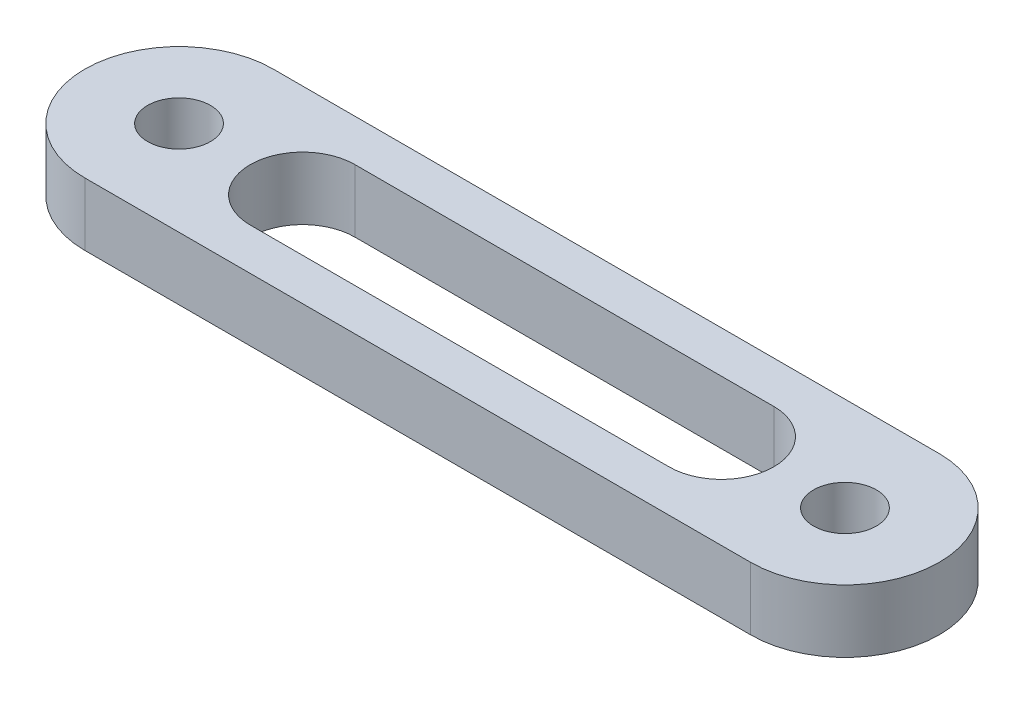
ISO-10303-21;
HEADER;
FILE_DESCRIPTION(('STEP AP214'),'2;1');
FILE_NAME('part.step','',(''),(''),'','','');
FILE_SCHEMA(('AUTOMOTIVE_DESIGN { 1 0 10303 214 1 1 1 1 }'));
ENDSEC;
DATA;
#1=APPLICATION_CONTEXT('core data for automotive mechanical design processes');
#2=APPLICATION_PROTOCOL_DEFINITION('international standard','automotive_design',2000,#1);
#3=PRODUCT_CONTEXT('',#1,'mechanical');
#4=PRODUCT('Part','Part','',(#3));
#5=PRODUCT_RELATED_PRODUCT_CATEGORY('part','',(#4));
#6=PRODUCT_DEFINITION_FORMATION('','',#4);
#7=PRODUCT_DEFINITION_CONTEXT('part definition',#1,'design');
#8=PRODUCT_DEFINITION('design','',#6,#7);
#9=PRODUCT_DEFINITION_SHAPE('','',#8);
#10=(LENGTH_UNIT() NAMED_UNIT(*) SI_UNIT(.MILLI.,.METRE.));
#11=(NAMED_UNIT(*) PLANE_ANGLE_UNIT() SI_UNIT($,.RADIAN.));
#12=(NAMED_UNIT(*) SI_UNIT($,.STERADIAN.) SOLID_ANGLE_UNIT());
#13=UNCERTAINTY_MEASURE_WITH_UNIT(LENGTH_MEASURE(1.E-05),#10,'distance_accuracy_value','');
#14=(GEOMETRIC_REPRESENTATION_CONTEXT(3) GLOBAL_UNCERTAINTY_ASSIGNED_CONTEXT((#13)) GLOBAL_UNIT_ASSIGNED_CONTEXT((#10,
#11,#12)) REPRESENTATION_CONTEXT('',''));
#15=CARTESIAN_POINT('',(0.,0.,0.));
#16=DIRECTION('',(0.,0.,1.));
#17=DIRECTION('',(1.,0.,0.));
#18=AXIS2_PLACEMENT_3D('',#15,#16,#17);
#19=CARTESIAN_POINT('',(-15.9,3.,0.));
#20=DIRECTION('',(0.,-1.,0.));
#21=DIRECTION('',(0.,0.,-1.));
#22=AXIS2_PLACEMENT_3D('',#19,#20,#21);
#23=CYLINDRICAL_SURFACE('',#22,4.5);
#24=CARTESIAN_POINT('',(-15.9,0.,0.));
#25=DIRECTION('',(0.,1.,0.));
#26=DIRECTION('',(0.,0.,1.));
#27=AXIS2_PLACEMENT_3D('',#24,#25,#26);
#28=CIRCLE('',#27,4.5);
#29=CARTESIAN_POINT('',(-15.9,0.,-4.5));
#30=VERTEX_POINT('',#29);
#31=CARTESIAN_POINT('',(-15.9,0.,4.50000000000001));
#32=VERTEX_POINT('',#31);
#33=EDGE_CURVE('E162',#30,#32,#28,.T.);
#34=ORIENTED_EDGE('',*,*,#33,.T.);
#35=DIRECTION('',(0.,-1.,0.));
#36=VECTOR('',#35,1.);
#37=CARTESIAN_POINT('',(-15.9,3.,4.50000000000001));
#38=LINE('',#37,#36);
#39=CARTESIAN_POINT('',(-15.9,3.,4.50000000000001));
#40=VERTEX_POINT('',#39);
#41=EDGE_CURVE('E11',#40,#32,#38,.T.);
#42=ORIENTED_EDGE('',*,*,#41,.F.);
#43=CARTESIAN_POINT('',(-15.9,3.,0.));
#44=DIRECTION('',(0.,1.,0.));
#45=DIRECTION('',(0.,0.,1.));
#46=AXIS2_PLACEMENT_3D('',#43,#44,#45);
#47=CIRCLE('',#46,4.5);
#48=CARTESIAN_POINT('',(-15.9,3.,-4.5));
#49=VERTEX_POINT('',#48);
#50=EDGE_CURVE('E145',#49,#40,#47,.T.);
#51=ORIENTED_EDGE('',*,*,#50,.F.);
#52=DIRECTION('',(0.,-1.,0.));
#53=VECTOR('',#52,1.);
#54=CARTESIAN_POINT('',(-15.9,3.,-4.5));
#55=LINE('',#54,#53);
#56=EDGE_CURVE('E159',#49,#30,#55,.T.);
#57=ORIENTED_EDGE('',*,*,#56,.T.);
#58=EDGE_LOOP('',(#34,#42,#51,#57));
#59=FACE_BOUND('',#58,.T.);
#60=ADVANCED_FACE('F41',(#59),#23,.T.);
#61=CARTESIAN_POINT('',(0.,3.,4.50000000000001));
#62=DIRECTION('',(0.,0.,1.));
#63=DIRECTION('',(1.,0.,0.));
#64=AXIS2_PLACEMENT_3D('',#61,#62,#63);
#65=PLANE('',#64);
#66=DIRECTION('',(-1.,0.,0.));
#67=VECTOR('',#66,1.);
#68=CARTESIAN_POINT('',(0.,0.,4.50000000000001));
#69=LINE('',#68,#67);
#70=CARTESIAN_POINT('',(15.9,0.,4.5));
#71=VERTEX_POINT('',#70);
#72=EDGE_CURVE('E165',#71,#32,#69,.T.);
#73=ORIENTED_EDGE('',*,*,#72,.F.);
#74=DIRECTION('',(0.,-1.,0.));
#75=VECTOR('',#74,1.);
#76=CARTESIAN_POINT('',(15.9,3.,4.5));
#77=LINE('',#76,#75);
#78=CARTESIAN_POINT('',(15.9,3.,4.5));
#79=VERTEX_POINT('',#78);
#80=EDGE_CURVE('E49',#79,#71,#77,.T.);
#81=ORIENTED_EDGE('',*,*,#80,.F.);
#82=DIRECTION('',(-1.,0.,0.));
#83=VECTOR('',#82,1.);
#84=CARTESIAN_POINT('',(0.,3.,4.50000000000001));
#85=LINE('',#84,#83);
#86=EDGE_CURVE('E148',#79,#40,#85,.T.);
#87=ORIENTED_EDGE('',*,*,#86,.T.);
#88=ORIENTED_EDGE('',*,*,#41,.T.);
#89=EDGE_LOOP('',(#73,#81,#87,#88));
#90=FACE_BOUND('',#89,.T.);
#91=ADVANCED_FACE('F190',(#90),#65,.T.);
#92=CARTESIAN_POINT('',(15.9,3.,0.));
#93=DIRECTION('',(0.,-1.,0.));
#94=DIRECTION('',(0.,0.,-1.));
#95=AXIS2_PLACEMENT_3D('',#92,#93,#94);
#96=CYLINDRICAL_SURFACE('',#95,4.5);
#97=CARTESIAN_POINT('',(15.9,0.,0.));
#98=DIRECTION('',(0.,1.,0.));
#99=DIRECTION('',(0.,0.,1.));
#100=AXIS2_PLACEMENT_3D('',#97,#98,#99);
#101=CIRCLE('',#100,4.5);
#102=CARTESIAN_POINT('',(15.9,0.,-4.50000000000001));
#103=VERTEX_POINT('',#102);
#104=EDGE_CURVE('E168',#71,#103,#101,.T.);
#105=ORIENTED_EDGE('',*,*,#104,.T.);
#106=DIRECTION('',(0.,-1.,0.));
#107=VECTOR('',#106,1.);
#108=CARTESIAN_POINT('',(15.9,3.,-4.50000000000001));
#109=LINE('',#108,#107);
#110=CARTESIAN_POINT('',(15.9,3.,-4.50000000000001));
#111=VERTEX_POINT('',#110);
#112=EDGE_CURVE('E177',#111,#103,#109,.T.);
#113=ORIENTED_EDGE('',*,*,#112,.F.);
#114=CARTESIAN_POINT('',(15.9,3.,0.));
#115=DIRECTION('',(0.,1.,0.));
#116=DIRECTION('',(0.,0.,1.));
#117=AXIS2_PLACEMENT_3D('',#114,#115,#116);
#118=CIRCLE('',#117,4.5);
#119=EDGE_CURVE('E151',#79,#111,#118,.T.);
#120=ORIENTED_EDGE('',*,*,#119,.F.);
#121=ORIENTED_EDGE('',*,*,#80,.T.);
#122=EDGE_LOOP('',(#105,#113,#120,#121));
#123=FACE_BOUND('',#122,.T.);
#124=ADVANCED_FACE('F181',(#123),#96,.T.);
#125=CARTESIAN_POINT('',(0.,3.,-4.50000000000002));
#126=DIRECTION('',(0.,0.,-1.));
#127=DIRECTION('',(-1.,0.,0.));
#128=AXIS2_PLACEMENT_3D('',#125,#126,#127);
#129=PLANE('',#128);
#130=DIRECTION('',(1.,0.,0.));
#131=VECTOR('',#130,1.);
#132=CARTESIAN_POINT('',(0.,0.,-4.50000000000002));
#133=LINE('',#132,#131);
#134=EDGE_CURVE('E171',#30,#103,#133,.T.);
#135=ORIENTED_EDGE('',*,*,#134,.F.);
#136=ORIENTED_EDGE('',*,*,#56,.F.);
#137=DIRECTION('',(1.,0.,0.));
#138=VECTOR('',#137,1.);
#139=CARTESIAN_POINT('',(0.,3.,-4.50000000000002));
#140=LINE('',#139,#138);
#141=EDGE_CURVE('E153',#49,#111,#140,.T.);
#142=ORIENTED_EDGE('',*,*,#141,.T.);
#143=ORIENTED_EDGE('',*,*,#112,.T.);
#144=EDGE_LOOP('',(#135,#136,#142,#143));
#145=FACE_BOUND('',#144,.T.);
#146=ADVANCED_FACE('F195',(#145),#129,.T.);
#147=CARTESIAN_POINT('',(-15.9,3.,0.));
#148=DIRECTION('',(0.,-1.,0.));
#149=DIRECTION('',(0.,0.,-1.));
#150=AXIS2_PLACEMENT_3D('',#147,#148,#149);
#151=CYLINDRICAL_SURFACE('',#150,1.5);
#152=CARTESIAN_POINT('',(-15.9,3.,0.));
#153=DIRECTION('',(0.,1.,0.));
#154=DIRECTION('',(0.,0.,1.));
#155=AXIS2_PLACEMENT_3D('',#152,#153,#154);
#156=CIRCLE('',#155,1.5);
#157=CARTESIAN_POINT('',(-15.9,3.,1.5));
#158=VERTEX_POINT('',#157);
#159=EDGE_CURVE('E142',#158,#158,#156,.T.);
#160=ORIENTED_EDGE('',*,*,#159,.T.);
#161=EDGE_LOOP('',(#160));
#162=FACE_BOUND('',#161,.T.);
#163=CARTESIAN_POINT('',(-15.9,0.,0.));
#164=DIRECTION('',(0.,1.,0.));
#165=DIRECTION('',(0.,0.,1.));
#166=AXIS2_PLACEMENT_3D('',#163,#164,#165);
#167=CIRCLE('',#166,1.5);
#168=CARTESIAN_POINT('',(-15.9,0.,1.5));
#169=VERTEX_POINT('',#168);
#170=EDGE_CURVE('E138',#169,#169,#167,.T.);
#171=ORIENTED_EDGE('',*,*,#170,.F.);
#172=EDGE_LOOP('',(#171));
#173=FACE_BOUND('',#172,.T.);
#174=ADVANCED_FACE('F43',(#162,#173),#151,.F.);
#175=CARTESIAN_POINT('',(15.9,3.,0.));
#176=DIRECTION('',(0.,-1.,0.));
#177=DIRECTION('',(0.,0.,-1.));
#178=AXIS2_PLACEMENT_3D('',#175,#176,#177);
#179=CYLINDRICAL_SURFACE('',#178,1.5);
#180=CARTESIAN_POINT('',(15.9,3.,0.));
#181=DIRECTION('',(0.,1.,0.));
#182=DIRECTION('',(0.,0.,1.));
#183=AXIS2_PLACEMENT_3D('',#180,#181,#182);
#184=CIRCLE('',#183,1.5);
#185=CARTESIAN_POINT('',(15.9,3.,1.49999999999999));
#186=VERTEX_POINT('',#185);
#187=EDGE_CURVE('E156',#186,#186,#184,.T.);
#188=ORIENTED_EDGE('',*,*,#187,.T.);
#189=EDGE_LOOP('',(#188));
#190=FACE_BOUND('',#189,.T.);
#191=CARTESIAN_POINT('',(15.9,0.,0.));
#192=DIRECTION('',(0.,1.,0.));
#193=DIRECTION('',(0.,0.,1.));
#194=AXIS2_PLACEMENT_3D('',#191,#192,#193);
#195=CIRCLE('',#194,1.5);
#196=CARTESIAN_POINT('',(15.9,0.,1.49999999999999));
#197=VERTEX_POINT('',#196);
#198=EDGE_CURVE('E146',#197,#197,#195,.T.);
#199=ORIENTED_EDGE('',*,*,#198,.F.);
#200=EDGE_LOOP('',(#199));
#201=FACE_BOUND('',#200,.T.);
#202=ADVANCED_FACE('F201',(#190,#201),#179,.F.);
#203=CARTESIAN_POINT('',(0.,3.,0.));
#204=DIRECTION('',(0.,1.,0.));
#205=DIRECTION('',(0.,0.,1.));
#206=AXIS2_PLACEMENT_3D('',#203,#204,#205);
#207=PLANE('',#206);
#208=CARTESIAN_POINT('',(-10.,3.,0.));
#209=DIRECTION('',(0.,1.,0.));
#210=DIRECTION('',(0.,0.,1.));
#211=AXIS2_PLACEMENT_3D('',#208,#209,#210);
#212=CIRCLE('',#211,2.5);
#213=CARTESIAN_POINT('',(-10.,3.,-2.5));
#214=VERTEX_POINT('',#213);
#215=CARTESIAN_POINT('',(-10.,3.,2.5));
#216=VERTEX_POINT('',#215);
#217=EDGE_CURVE('E56',#214,#216,#212,.T.);
#218=ORIENTED_EDGE('',*,*,#217,.F.);
#219=DIRECTION('',(-1.,0.,0.));
#220=VECTOR('',#219,1.);
#221=CARTESIAN_POINT('',(-10.,3.,-2.5));
#222=LINE('',#221,#220);
#223=CARTESIAN_POINT('',(10.,3.,-2.50000000000001));
#224=VERTEX_POINT('',#223);
#225=EDGE_CURVE('E123',#224,#214,#222,.T.);
#226=ORIENTED_EDGE('',*,*,#225,.F.);
#227=CARTESIAN_POINT('',(10.,3.,0.));
#228=DIRECTION('',(0.,1.,0.));
#229=DIRECTION('',(0.,0.,1.));
#230=AXIS2_PLACEMENT_3D('',#227,#228,#229);
#231=CIRCLE('',#230,2.5);
#232=CARTESIAN_POINT('',(10.,3.,2.5));
#233=VERTEX_POINT('',#232);
#234=EDGE_CURVE('E126',#233,#224,#231,.T.);
#235=ORIENTED_EDGE('',*,*,#234,.F.);
#236=DIRECTION('',(1.,0.,0.));
#237=VECTOR('',#236,1.);
#238=CARTESIAN_POINT('',(-10.,3.,2.5));
#239=LINE('',#238,#237);
#240=EDGE_CURVE('E132',#216,#233,#239,.T.);
#241=ORIENTED_EDGE('',*,*,#240,.F.);
#242=EDGE_LOOP('',(#218,#226,#235,#241));
#243=FACE_BOUND('',#242,.T.);
#244=ORIENTED_EDGE('',*,*,#159,.F.);
#245=EDGE_LOOP('',(#244));
#246=FACE_BOUND('',#245,.T.);
#247=ORIENTED_EDGE('',*,*,#50,.T.);
#248=ORIENTED_EDGE('',*,*,#86,.F.);
#249=ORIENTED_EDGE('',*,*,#119,.T.);
#250=ORIENTED_EDGE('',*,*,#141,.F.);
#251=EDGE_LOOP('',(#247,#248,#249,#250));
#252=FACE_BOUND('',#251,.T.);
#253=ORIENTED_EDGE('',*,*,#187,.F.);
#254=EDGE_LOOP('',(#253));
#255=FACE_BOUND('',#254,.T.);
#256=ADVANCED_FACE('F198',(#243,#246,#252,#255),#207,.T.);
#257=CARTESIAN_POINT('',(0.,0.,0.));
#258=DIRECTION('',(0.,1.,0.));
#259=DIRECTION('',(0.,0.,1.));
#260=AXIS2_PLACEMENT_3D('',#257,#258,#259);
#261=PLANE('',#260);
#262=DIRECTION('',(-1.,0.,0.));
#263=VECTOR('',#262,1.);
#264=CARTESIAN_POINT('',(-10.,0.,-2.5));
#265=LINE('',#264,#263);
#266=CARTESIAN_POINT('',(10.,0.,-2.50000000000001));
#267=VERTEX_POINT('',#266);
#268=CARTESIAN_POINT('',(-10.,0.,-2.5));
#269=VERTEX_POINT('',#268);
#270=EDGE_CURVE('E113',#267,#269,#265,.T.);
#271=ORIENTED_EDGE('',*,*,#270,.T.);
#272=CARTESIAN_POINT('',(-10.,0.,0.));
#273=DIRECTION('',(0.,1.,0.));
#274=DIRECTION('',(0.,0.,1.));
#275=AXIS2_PLACEMENT_3D('',#272,#273,#274);
#276=CIRCLE('',#275,2.5);
#277=CARTESIAN_POINT('',(-10.,0.,2.5));
#278=VERTEX_POINT('',#277);
#279=EDGE_CURVE('E107',#269,#278,#276,.T.);
#280=ORIENTED_EDGE('',*,*,#279,.T.);
#281=DIRECTION('',(1.,0.,0.));
#282=VECTOR('',#281,1.);
#283=CARTESIAN_POINT('',(-10.,0.,2.5));
#284=LINE('',#283,#282);
#285=CARTESIAN_POINT('',(10.,0.,2.5));
#286=VERTEX_POINT('',#285);
#287=EDGE_CURVE('E116',#278,#286,#284,.T.);
#288=ORIENTED_EDGE('',*,*,#287,.T.);
#289=CARTESIAN_POINT('',(10.,0.,0.));
#290=DIRECTION('',(0.,1.,0.));
#291=DIRECTION('',(0.,0.,1.));
#292=AXIS2_PLACEMENT_3D('',#289,#290,#291);
#293=CIRCLE('',#292,2.5);
#294=EDGE_CURVE('E64',#286,#267,#293,.T.);
#295=ORIENTED_EDGE('',*,*,#294,.T.);
#296=EDGE_LOOP('',(#271,#280,#288,#295));
#297=FACE_BOUND('',#296,.T.);
#298=ORIENTED_EDGE('',*,*,#170,.T.);
#299=EDGE_LOOP('',(#298));
#300=FACE_BOUND('',#299,.T.);
#301=ORIENTED_EDGE('',*,*,#33,.F.);
#302=ORIENTED_EDGE('',*,*,#134,.T.);
#303=ORIENTED_EDGE('',*,*,#104,.F.);
#304=ORIENTED_EDGE('',*,*,#72,.T.);
#305=EDGE_LOOP('',(#301,#302,#303,#304));
#306=FACE_BOUND('',#305,.T.);
#307=ORIENTED_EDGE('',*,*,#198,.T.);
#308=EDGE_LOOP('',(#307));
#309=FACE_BOUND('',#308,.T.);
#310=ADVANCED_FACE('F120',(#297,#300,#306,#309),#261,.F.);
#311=CARTESIAN_POINT('',(-10.,0.,0.));
#312=DIRECTION('',(0.,1.,0.));
#313=DIRECTION('',(0.,0.,1.));
#314=AXIS2_PLACEMENT_3D('',#311,#312,#313);
#315=CYLINDRICAL_SURFACE('',#314,2.5);
#316=ORIENTED_EDGE('',*,*,#217,.T.);
#317=DIRECTION('',(0.,1.,0.));
#318=VECTOR('',#317,1.);
#319=CARTESIAN_POINT('',(-10.,0.,2.5));
#320=LINE('',#319,#318);
#321=EDGE_CURVE('E103',#278,#216,#320,.T.);
#322=ORIENTED_EDGE('',*,*,#321,.F.);
#323=ORIENTED_EDGE('',*,*,#279,.F.);
#324=DIRECTION('',(0.,1.,0.));
#325=VECTOR('',#324,1.);
#326=CARTESIAN_POINT('',(-10.,0.,-2.5));
#327=LINE('',#326,#325);
#328=EDGE_CURVE('E136',#269,#214,#327,.T.);
#329=ORIENTED_EDGE('',*,*,#328,.T.);
#330=EDGE_LOOP('',(#316,#322,#323,#329));
#331=FACE_BOUND('',#330,.T.);
#332=ADVANCED_FACE('F105',(#331),#315,.F.);
#333=CARTESIAN_POINT('',(-10.,0.,-2.5));
#334=DIRECTION('',(0.,0.,-1.));
#335=DIRECTION('',(-1.,0.,0.));
#336=AXIS2_PLACEMENT_3D('',#333,#334,#335);
#337=PLANE('',#336);
#338=ORIENTED_EDGE('',*,*,#225,.T.);
#339=ORIENTED_EDGE('',*,*,#328,.F.);
#340=ORIENTED_EDGE('',*,*,#270,.F.);
#341=DIRECTION('',(0.,1.,0.));
#342=VECTOR('',#341,1.);
#343=CARTESIAN_POINT('',(10.,0.,-2.50000000000001));
#344=LINE('',#343,#342);
#345=EDGE_CURVE('E139',#267,#224,#344,.T.);
#346=ORIENTED_EDGE('',*,*,#345,.T.);
#347=EDGE_LOOP('',(#338,#339,#340,#346));
#348=FACE_BOUND('',#347,.T.);
#349=ADVANCED_FACE('F215',(#348),#337,.F.);
#350=CARTESIAN_POINT('',(10.,0.,0.));
#351=DIRECTION('',(0.,1.,0.));
#352=DIRECTION('',(0.,0.,1.));
#353=AXIS2_PLACEMENT_3D('',#350,#351,#352);
#354=CYLINDRICAL_SURFACE('',#353,2.5);
#355=ORIENTED_EDGE('',*,*,#234,.T.);
#356=ORIENTED_EDGE('',*,*,#345,.F.);
#357=ORIENTED_EDGE('',*,*,#294,.F.);
#358=DIRECTION('',(0.,1.,0.));
#359=VECTOR('',#358,1.);
#360=CARTESIAN_POINT('',(10.,0.,2.5));
#361=LINE('',#360,#359);
#362=EDGE_CURVE('E112',#286,#233,#361,.T.);
#363=ORIENTED_EDGE('',*,*,#362,.T.);
#364=EDGE_LOOP('',(#355,#356,#357,#363));
#365=FACE_BOUND('',#364,.T.);
#366=ADVANCED_FACE('F267',(#365),#354,.F.);
#367=CARTESIAN_POINT('',(-10.,0.,2.5));
#368=DIRECTION('',(0.,0.,1.));
#369=DIRECTION('',(1.,0.,0.));
#370=AXIS2_PLACEMENT_3D('',#367,#368,#369);
#371=PLANE('',#370);
#372=ORIENTED_EDGE('',*,*,#240,.T.);
#373=ORIENTED_EDGE('',*,*,#362,.F.);
#374=ORIENTED_EDGE('',*,*,#287,.F.);
#375=ORIENTED_EDGE('',*,*,#321,.T.);
#376=EDGE_LOOP('',(#372,#373,#374,#375));
#377=FACE_BOUND('',#376,.T.);
#378=ADVANCED_FACE('F117',(#377),#371,.F.);
#379=CLOSED_SHELL('',(#60,#91,#124,#146,#174,#202,#256,#310,#332,#349,#366,#378));
#380=MANIFOLD_SOLID_BREP('B2',#379);
#381=ADVANCED_BREP_SHAPE_REPRESENTATION('',(#18,#380),#14);
#382=SHAPE_DEFINITION_REPRESENTATION(#9,#381);
ENDSEC;
END-ISO-10303-21;
